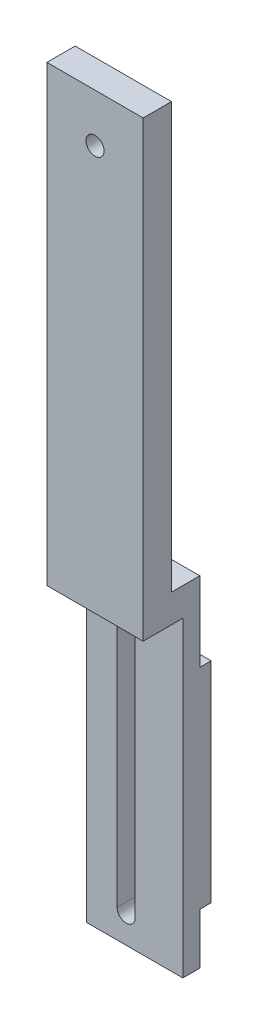
ISO-10303-21;
HEADER;
FILE_DESCRIPTION(('STEP AP214'),'2;1');
FILE_NAME('part.step','',(''),(''),'','','');
FILE_SCHEMA(('AUTOMOTIVE_DESIGN { 1 0 10303 214 1 1 1 1 }'));
ENDSEC;
DATA;
#1=APPLICATION_CONTEXT('core data for automotive mechanical design processes');
#2=APPLICATION_PROTOCOL_DEFINITION('international standard','automotive_design',2000,#1);
#3=PRODUCT_CONTEXT('',#1,'mechanical');
#4=PRODUCT('Part','Part','',(#3));
#5=PRODUCT_RELATED_PRODUCT_CATEGORY('part','',(#4));
#6=PRODUCT_DEFINITION_FORMATION('','',#4);
#7=PRODUCT_DEFINITION_CONTEXT('part definition',#1,'design');
#8=PRODUCT_DEFINITION('design','',#6,#7);
#9=PRODUCT_DEFINITION_SHAPE('','',#8);
#10=(LENGTH_UNIT() NAMED_UNIT(*) SI_UNIT(.MILLI.,.METRE.));
#11=(NAMED_UNIT(*) PLANE_ANGLE_UNIT() SI_UNIT($,.RADIAN.));
#12=(NAMED_UNIT(*) SI_UNIT($,.STERADIAN.) SOLID_ANGLE_UNIT());
#13=UNCERTAINTY_MEASURE_WITH_UNIT(LENGTH_MEASURE(1.E-05),#10,'distance_accuracy_value','');
#14=(GEOMETRIC_REPRESENTATION_CONTEXT(3) GLOBAL_UNCERTAINTY_ASSIGNED_CONTEXT((#13)) GLOBAL_UNIT_ASSIGNED_CONTEXT((#10,
#11,#12)) REPRESENTATION_CONTEXT('',''));
#15=CARTESIAN_POINT('',(0.,0.,0.));
#16=DIRECTION('',(0.,0.,1.));
#17=DIRECTION('',(1.,0.,0.));
#18=AXIS2_PLACEMENT_3D('',#15,#16,#17);
#19=CARTESIAN_POINT('',(8.5,0.,5.));
#20=DIRECTION('',(-1.,0.,0.));
#21=DIRECTION('',(0.,0.,1.));
#22=AXIS2_PLACEMENT_3D('',#19,#20,#21);
#23=PLANE('',#22);
#24=DIRECTION('',(0.,0.,-1.));
#25=VECTOR('',#24,1.);
#26=CARTESIAN_POINT('',(8.5,16.,2.));
#27=LINE('',#26,#25);
#28=CARTESIAN_POINT('',(8.5,16.,2.));
#29=VERTEX_POINT('',#28);
#30=CARTESIAN_POINT('',(8.5,16.,0.));
#31=VERTEX_POINT('',#30);
#32=EDGE_CURVE('E233',#29,#31,#27,.T.);
#33=ORIENTED_EDGE('',*,*,#32,.F.);
#34=DIRECTION('',(0.,-1.,0.));
#35=VECTOR('',#34,1.);
#36=CARTESIAN_POINT('',(8.5,0.,2.));
#37=LINE('',#36,#35);
#38=CARTESIAN_POINT('',(8.5,30.,2.));
#39=VERTEX_POINT('',#38);
#40=EDGE_CURVE('E200',#39,#29,#37,.T.);
#41=ORIENTED_EDGE('',*,*,#40,.F.);
#42=DIRECTION('',(0.,0.,-1.));
#43=VECTOR('',#42,1.);
#44=CARTESIAN_POINT('',(8.5,30.,5.));
#45=LINE('',#44,#43);
#46=CARTESIAN_POINT('',(8.5,30.,7.));
#47=VERTEX_POINT('',#46);
#48=EDGE_CURVE('E46',#47,#39,#45,.T.);
#49=ORIENTED_EDGE('',*,*,#48,.F.);
#50=DIRECTION('',(0.,-1.,0.));
#51=VECTOR('',#50,1.);
#52=CARTESIAN_POINT('',(8.5,105.,7.));
#53=LINE('',#52,#51);
#54=CARTESIAN_POINT('',(8.5,105.,7.));
#55=VERTEX_POINT('',#54);
#56=EDGE_CURVE('E299',#55,#47,#53,.T.);
#57=ORIENTED_EDGE('',*,*,#56,.F.);
#58=DIRECTION('',(0.,0.,-1.));
#59=VECTOR('',#58,1.);
#60=CARTESIAN_POINT('',(8.5,105.,12.));
#61=LINE('',#60,#59);
#62=CARTESIAN_POINT('',(8.5,105.,12.));
#63=VERTEX_POINT('',#62);
#64=EDGE_CURVE('E283',#63,#55,#61,.T.);
#65=ORIENTED_EDGE('',*,*,#64,.F.);
#66=DIRECTION('',(0.,1.,0.));
#67=VECTOR('',#66,1.);
#68=CARTESIAN_POINT('',(8.5,30.,12.));
#69=LINE('',#68,#67);
#70=CARTESIAN_POINT('',(8.5,25.,12.));
#71=VERTEX_POINT('',#70);
#72=EDGE_CURVE('E308',#71,#63,#69,.T.);
#73=ORIENTED_EDGE('',*,*,#72,.F.);
#74=DIRECTION('',(0.,0.,-1.));
#75=VECTOR('',#74,1.);
#76=CARTESIAN_POINT('',(8.5,25.,12.));
#77=LINE('',#76,#75);
#78=CARTESIAN_POINT('',(8.5,25.,5.));
#79=VERTEX_POINT('',#78);
#80=EDGE_CURVE('E310',#71,#79,#77,.T.);
#81=ORIENTED_EDGE('',*,*,#80,.T.);
#82=DIRECTION('',(0.,1.,0.));
#83=VECTOR('',#82,1.);
#84=CARTESIAN_POINT('',(8.5,0.,5.));
#85=LINE('',#84,#83);
#86=CARTESIAN_POINT('',(8.5,-30.,5.));
#87=VERTEX_POINT('',#86);
#88=EDGE_CURVE('E334',#87,#79,#85,.T.);
#89=ORIENTED_EDGE('',*,*,#88,.F.);
#90=DIRECTION('',(0.,0.,-1.));
#91=VECTOR('',#90,1.);
#92=CARTESIAN_POINT('',(8.5,-30.,5.));
#93=LINE('',#92,#91);
#94=CARTESIAN_POINT('',(8.5,-30.,2.));
#95=VERTEX_POINT('',#94);
#96=EDGE_CURVE('E11',#87,#95,#93,.T.);
#97=ORIENTED_EDGE('',*,*,#96,.T.);
#98=DIRECTION('',(0.,-1.,0.));
#99=VECTOR('',#98,1.);
#100=CARTESIAN_POINT('',(8.5,0.,2.));
#101=LINE('',#100,#99);
#102=CARTESIAN_POINT('',(8.5,-21.,2.));
#103=VERTEX_POINT('',#102);
#104=EDGE_CURVE('E258',#103,#95,#101,.T.);
#105=ORIENTED_EDGE('',*,*,#104,.F.);
#106=DIRECTION('',(0.,0.,-1.));
#107=VECTOR('',#106,1.);
#108=CARTESIAN_POINT('',(8.5,-21.,2.));
#109=LINE('',#108,#107);
#110=CARTESIAN_POINT('',(8.5,-21.,0.));
#111=VERTEX_POINT('',#110);
#112=EDGE_CURVE('E229',#103,#111,#109,.T.);
#113=ORIENTED_EDGE('',*,*,#112,.T.);
#114=DIRECTION('',(0.,1.,0.));
#115=VECTOR('',#114,1.);
#116=CARTESIAN_POINT('',(8.5,0.,0.));
#117=LINE('',#116,#115);
#118=EDGE_CURVE('E352',#111,#31,#117,.T.);
#119=ORIENTED_EDGE('',*,*,#118,.T.);
#120=EDGE_LOOP('',(#33,#41,#49,#57,#65,#73,#81,#89,#97,#105,#113,#119));
#121=FACE_BOUND('',#120,.T.);
#122=ADVANCED_FACE('F37',(#121),#23,.F.);
#123=CARTESIAN_POINT('',(0.,30.,5.));
#124=DIRECTION('',(0.,1.,0.));
#125=DIRECTION('',(0.,0.,1.));
#126=AXIS2_PLACEMENT_3D('',#123,#124,#125);
#127=PLANE('',#126);
#128=DIRECTION('',(1.,0.,0.));
#129=VECTOR('',#128,1.);
#130=CARTESIAN_POINT('',(0.,30.,2.));
#131=LINE('',#130,#129);
#132=CARTESIAN_POINT('',(0.5,30.,2.));
#133=VERTEX_POINT('',#132);
#134=EDGE_CURVE('E224',#133,#39,#131,.T.);
#135=ORIENTED_EDGE('',*,*,#134,.F.);
#136=DIRECTION('',(0.,0.,-1.));
#137=VECTOR('',#136,1.);
#138=CARTESIAN_POINT('',(0.5,30.,2.));
#139=LINE('',#138,#137);
#140=CARTESIAN_POINT('',(0.5,30.,0.));
#141=VERTEX_POINT('',#140);
#142=EDGE_CURVE('E236',#133,#141,#139,.T.);
#143=ORIENTED_EDGE('',*,*,#142,.T.);
#144=DIRECTION('',(1.,0.,0.));
#145=VECTOR('',#144,1.);
#146=CARTESIAN_POINT('',(0.,30.,0.));
#147=LINE('',#146,#145);
#148=CARTESIAN_POINT('',(-8.5,30.,0.));
#149=VERTEX_POINT('',#148);
#150=EDGE_CURVE('E355',#149,#141,#147,.T.);
#151=ORIENTED_EDGE('',*,*,#150,.F.);
#152=DIRECTION('',(0.,0.,-1.));
#153=VECTOR('',#152,1.);
#154=CARTESIAN_POINT('',(-8.5,30.,5.));
#155=LINE('',#154,#153);
#156=CARTESIAN_POINT('',(-8.5,30.,7.));
#157=VERTEX_POINT('',#156);
#158=EDGE_CURVE('E362',#157,#149,#155,.T.);
#159=ORIENTED_EDGE('',*,*,#158,.F.);
#160=DIRECTION('',(-1.,0.,0.));
#161=VECTOR('',#160,1.);
#162=CARTESIAN_POINT('',(8.5,30.,7.));
#163=LINE('',#162,#161);
#164=EDGE_CURVE('E280',#47,#157,#163,.T.);
#165=ORIENTED_EDGE('',*,*,#164,.F.);
#166=ORIENTED_EDGE('',*,*,#48,.T.);
#167=EDGE_LOOP('',(#135,#143,#151,#159,#165,#166));
#168=FACE_BOUND('',#167,.T.);
#169=ADVANCED_FACE('F391',(#168),#127,.T.);
#170=CARTESIAN_POINT('',(-1.5,-25.,5.));
#171=DIRECTION('',(0.,0.,-1.));
#172=DIRECTION('',(-1.,0.,0.));
#173=AXIS2_PLACEMENT_3D('',#170,#171,#172);
#174=CYLINDRICAL_SURFACE('',#173,1.6);
#175=CARTESIAN_POINT('',(-1.5,-25.,2.));
#176=DIRECTION('',(0.,0.,-1.));
#177=DIRECTION('',(-1.,0.,0.));
#178=AXIS2_PLACEMENT_3D('',#175,#176,#177);
#179=CIRCLE('',#178,1.6);
#180=CARTESIAN_POINT('',(-1.5,-26.6,2.));
#181=VERTEX_POINT('',#180);
#182=CARTESIAN_POINT('',(0.100000000000002,-25.,2.));
#183=VERTEX_POINT('',#182);
#184=EDGE_CURVE('E251',#181,#183,#179,.F.);
#185=ORIENTED_EDGE('',*,*,#184,.F.);
#186=DIRECTION('',(0.,0.,-1.));
#187=VECTOR('',#186,1.);
#188=CARTESIAN_POINT('',(-1.5,-26.6,2.));
#189=LINE('',#188,#187);
#190=CARTESIAN_POINT('',(-1.5,-26.6,0.));
#191=VERTEX_POINT('',#190);
#192=EDGE_CURVE('E271',#181,#191,#189,.T.);
#193=ORIENTED_EDGE('',*,*,#192,.T.);
#194=CARTESIAN_POINT('',(-1.5,-25.,0.));
#195=DIRECTION('',(0.,0.,1.));
#196=DIRECTION('',(1.,0.,0.));
#197=AXIS2_PLACEMENT_3D('',#194,#195,#196);
#198=CIRCLE('',#197,1.6);
#199=CARTESIAN_POINT('',(-3.1,-25.,0.));
#200=VERTEX_POINT('',#199);
#201=EDGE_CURVE('E318',#200,#191,#198,.T.);
#202=ORIENTED_EDGE('',*,*,#201,.F.);
#203=DIRECTION('',(0.,0.,-1.));
#204=VECTOR('',#203,1.);
#205=CARTESIAN_POINT('',(-3.1,-25.,5.));
#206=LINE('',#205,#204);
#207=CARTESIAN_POINT('',(-3.1,-25.,5.));
#208=VERTEX_POINT('',#207);
#209=EDGE_CURVE('E41',#208,#200,#206,.T.);
#210=ORIENTED_EDGE('',*,*,#209,.F.);
#211=CARTESIAN_POINT('',(-1.5,-25.,5.));
#212=DIRECTION('',(0.,0.,1.));
#213=DIRECTION('',(1.,0.,0.));
#214=AXIS2_PLACEMENT_3D('',#211,#212,#213);
#215=CIRCLE('',#214,1.6);
#216=CARTESIAN_POINT('',(0.100000000000002,-25.,5.));
#217=VERTEX_POINT('',#216);
#218=EDGE_CURVE('E319',#208,#217,#215,.T.);
#219=ORIENTED_EDGE('',*,*,#218,.T.);
#220=DIRECTION('',(0.,0.,-1.));
#221=VECTOR('',#220,1.);
#222=CARTESIAN_POINT('',(0.100000000000002,-25.,5.));
#223=LINE('',#222,#221);
#224=EDGE_CURVE('E339',#217,#183,#223,.T.);
#225=ORIENTED_EDGE('',*,*,#224,.T.);
#226=EDGE_LOOP('',(#185,#193,#202,#210,#219,#225));
#227=FACE_BOUND('',#226,.T.);
#228=ADVANCED_FACE('F39',(#227),#174,.F.);
#229=CARTESIAN_POINT('',(0.0999999999999946,0.,5.));
#230=DIRECTION('',(1.,0.,0.));
#231=DIRECTION('',(0.,1.,0.));
#232=AXIS2_PLACEMENT_3D('',#229,#230,#231);
#233=PLANE('',#232);
#234=DIRECTION('',(0.,0.,-1.));
#235=VECTOR('',#234,1.);
#236=CARTESIAN_POINT('',(0.0999999999999898,16.,2.));
#237=LINE('',#236,#235);
#238=CARTESIAN_POINT('',(0.0999999999999898,16.,2.));
#239=VERTEX_POINT('',#238);
#240=CARTESIAN_POINT('',(0.0999999999999898,16.,0.));
#241=VERTEX_POINT('',#240);
#242=EDGE_CURVE('E189',#239,#241,#237,.T.);
#243=ORIENTED_EDGE('',*,*,#242,.T.);
#244=DIRECTION('',(0.,-1.,0.));
#245=VECTOR('',#244,1.);
#246=CARTESIAN_POINT('',(0.0999999999999946,0.,0.));
#247=LINE('',#246,#245);
#248=CARTESIAN_POINT('',(0.100000000000001,-21.,0.));
#249=VERTEX_POINT('',#248);
#250=EDGE_CURVE('E347',#241,#249,#247,.T.);
#251=ORIENTED_EDGE('',*,*,#250,.T.);
#252=DIRECTION('',(0.,0.,-1.));
#253=VECTOR('',#252,1.);
#254=CARTESIAN_POINT('',(0.100000000000001,-21.,2.));
#255=LINE('',#254,#253);
#256=CARTESIAN_POINT('',(0.100000000000001,-21.,2.));
#257=VERTEX_POINT('',#256);
#258=EDGE_CURVE('E269',#257,#249,#255,.T.);
#259=ORIENTED_EDGE('',*,*,#258,.F.);
#260=DIRECTION('',(0.,1.,0.));
#261=VECTOR('',#260,1.);
#262=CARTESIAN_POINT('',(0.0999999999999946,0.,2.));
#263=LINE('',#262,#261);
#264=EDGE_CURVE('E253',#183,#257,#263,.T.);
#265=ORIENTED_EDGE('',*,*,#264,.F.);
#266=ORIENTED_EDGE('',*,*,#224,.F.);
#267=DIRECTION('',(0.,-1.,0.));
#268=VECTOR('',#267,1.);
#269=CARTESIAN_POINT('',(0.0999999999999946,0.,5.));
#270=LINE('',#269,#268);
#271=CARTESIAN_POINT('',(0.0999999999999887,20.,5.));
#272=VERTEX_POINT('',#271);
#273=EDGE_CURVE('E329',#272,#217,#270,.T.);
#274=ORIENTED_EDGE('',*,*,#273,.F.);
#275=DIRECTION('',(0.,0.,-1.));
#276=VECTOR('',#275,1.);
#277=CARTESIAN_POINT('',(0.0999999999999887,20.,5.));
#278=LINE('',#277,#276);
#279=CARTESIAN_POINT('',(0.0999999999999883,20.,2.));
#280=VERTEX_POINT('',#279);
#281=EDGE_CURVE('E214',#272,#280,#278,.T.);
#282=ORIENTED_EDGE('',*,*,#281,.T.);
#283=DIRECTION('',(0.,1.,0.));
#284=VECTOR('',#283,1.);
#285=CARTESIAN_POINT('',(0.0999999999999946,0.,2.));
#286=LINE('',#285,#284);
#287=EDGE_CURVE('E205',#239,#280,#286,.T.);
#288=ORIENTED_EDGE('',*,*,#287,.F.);
#289=EDGE_LOOP('',(#243,#251,#259,#265,#266,#274,#282,#288));
#290=FACE_BOUND('',#289,.T.);
#291=ADVANCED_FACE('F212',(#290),#233,.F.);
#292=CARTESIAN_POINT('',(0.,0.,0.));
#293=DIRECTION('',(0.,0.,1.));
#294=DIRECTION('',(1.,0.,0.));
#295=AXIS2_PLACEMENT_3D('',#292,#293,#294);
#296=PLANE('',#295);
#297=DIRECTION('',(1.,0.,0.));
#298=VECTOR('',#297,1.);
#299=CARTESIAN_POINT('',(0.,16.,0.));
#300=LINE('',#299,#298);
#301=EDGE_CURVE('E195',#241,#31,#300,.T.);
#302=ORIENTED_EDGE('',*,*,#301,.T.);
#303=ORIENTED_EDGE('',*,*,#118,.F.);
#304=DIRECTION('',(-1.,0.,0.));
#305=VECTOR('',#304,1.);
#306=CARTESIAN_POINT('',(0.,-21.,0.));
#307=LINE('',#306,#305);
#308=EDGE_CURVE('E246',#111,#249,#307,.T.);
#309=ORIENTED_EDGE('',*,*,#308,.T.);
#310=ORIENTED_EDGE('',*,*,#250,.F.);
#311=EDGE_LOOP('',(#302,#303,#309,#310));
#312=FACE_BOUND('',#311,.T.);
#313=ADVANCED_FACE('F408',(#312),#296,.F.);
#314=DIRECTION('',(0.,-1.,0.));
#315=VECTOR('',#314,1.);
#316=CARTESIAN_POINT('',(0.499999999999997,0.,0.));
#317=LINE('',#316,#315);
#318=CARTESIAN_POINT('',(0.499999999999999,21.6,0.));
#319=VERTEX_POINT('',#318);
#320=EDGE_CURVE('E209',#141,#319,#317,.T.);
#321=ORIENTED_EDGE('',*,*,#320,.T.);
#322=DIRECTION('',(1.,0.,0.));
#323=VECTOR('',#322,1.);
#324=CARTESIAN_POINT('',(0.,21.6,0.));
#325=LINE('',#324,#323);
#326=CARTESIAN_POINT('',(-1.50000000000001,21.6,0.));
#327=VERTEX_POINT('',#326);
#328=EDGE_CURVE('E228',#327,#319,#325,.T.);
#329=ORIENTED_EDGE('',*,*,#328,.F.);
#330=CARTESIAN_POINT('',(-1.50000000000001,20.,0.));
#331=DIRECTION('',(0.,0.,1.));
#332=DIRECTION('',(1.,0.,0.));
#333=AXIS2_PLACEMENT_3D('',#330,#331,#332);
#334=CIRCLE('',#333,1.6);
#335=CARTESIAN_POINT('',(-3.10000000000001,20.,0.));
#336=VERTEX_POINT('',#335);
#337=EDGE_CURVE('E345',#327,#336,#334,.T.);
#338=ORIENTED_EDGE('',*,*,#337,.T.);
#339=DIRECTION('',(0.,-1.,0.));
#340=VECTOR('',#339,1.);
#341=CARTESIAN_POINT('',(-3.10000000000001,0.,0.));
#342=LINE('',#341,#340);
#343=EDGE_CURVE('E342',#336,#200,#342,.T.);
#344=ORIENTED_EDGE('',*,*,#343,.T.);
#345=ORIENTED_EDGE('',*,*,#201,.T.);
#346=DIRECTION('',(1.,0.,0.));
#347=VECTOR('',#346,1.);
#348=CARTESIAN_POINT('',(0.,-26.6,0.));
#349=LINE('',#348,#347);
#350=CARTESIAN_POINT('',(0.499999999999997,-26.6,0.));
#351=VERTEX_POINT('',#350);
#352=EDGE_CURVE('E262',#191,#351,#349,.T.);
#353=ORIENTED_EDGE('',*,*,#352,.T.);
#354=DIRECTION('',(0.,1.,0.));
#355=VECTOR('',#354,1.);
#356=CARTESIAN_POINT('',(0.499999999999981,0.,0.));
#357=LINE('',#356,#355);
#358=CARTESIAN_POINT('',(0.499999999999998,-30.,0.));
#359=VERTEX_POINT('',#358);
#360=EDGE_CURVE('E260',#359,#351,#357,.T.);
#361=ORIENTED_EDGE('',*,*,#360,.F.);
#362=DIRECTION('',(1.,0.,0.));
#363=VECTOR('',#362,1.);
#364=CARTESIAN_POINT('',(0.,-30.,0.));
#365=LINE('',#364,#363);
#366=CARTESIAN_POINT('',(-8.5,-30.,0.));
#367=VERTEX_POINT('',#366);
#368=EDGE_CURVE('E349',#367,#359,#365,.T.);
#369=ORIENTED_EDGE('',*,*,#368,.F.);
#370=DIRECTION('',(0.,1.,0.));
#371=VECTOR('',#370,1.);
#372=CARTESIAN_POINT('',(-8.5,0.,0.));
#373=LINE('',#372,#371);
#374=EDGE_CURVE('E323',#367,#149,#373,.T.);
#375=ORIENTED_EDGE('',*,*,#374,.T.);
#376=ORIENTED_EDGE('',*,*,#150,.T.);
#377=EDGE_LOOP('',(#321,#329,#338,#344,#345,#353,#361,#369,#375,#376));
#378=FACE_BOUND('',#377,.T.);
#379=ADVANCED_FACE('F381',(#378),#296,.F.);
#380=CARTESIAN_POINT('',(0.,-30.,5.));
#381=DIRECTION('',(0.,1.,0.));
#382=DIRECTION('',(0.,0.,1.));
#383=AXIS2_PLACEMENT_3D('',#380,#381,#382);
#384=PLANE('',#383);
#385=ORIENTED_EDGE('',*,*,#368,.T.);
#386=DIRECTION('',(0.,0.,-1.));
#387=VECTOR('',#386,1.);
#388=CARTESIAN_POINT('',(0.499999999999999,-30.,2.));
#389=LINE('',#388,#387);
#390=CARTESIAN_POINT('',(0.499999999999999,-30.,2.));
#391=VERTEX_POINT('',#390);
#392=EDGE_CURVE('E54',#391,#359,#389,.T.);
#393=ORIENTED_EDGE('',*,*,#392,.F.);
#394=DIRECTION('',(-1.,0.,0.));
#395=VECTOR('',#394,1.);
#396=CARTESIAN_POINT('',(0.,-30.,2.));
#397=LINE('',#396,#395);
#398=EDGE_CURVE('E242',#95,#391,#397,.T.);
#399=ORIENTED_EDGE('',*,*,#398,.F.);
#400=ORIENTED_EDGE('',*,*,#96,.F.);
#401=DIRECTION('',(1.,0.,0.));
#402=VECTOR('',#401,1.);
#403=CARTESIAN_POINT('',(0.,-30.,5.));
#404=LINE('',#403,#402);
#405=CARTESIAN_POINT('',(-8.5,-30.,5.));
#406=VERTEX_POINT('',#405);
#407=EDGE_CURVE('E331',#406,#87,#404,.T.);
#408=ORIENTED_EDGE('',*,*,#407,.F.);
#409=DIRECTION('',(0.,0.,-1.));
#410=VECTOR('',#409,1.);
#411=CARTESIAN_POINT('',(-8.5,-30.,5.));
#412=LINE('',#411,#410);
#413=EDGE_CURVE('E360',#406,#367,#412,.T.);
#414=ORIENTED_EDGE('',*,*,#413,.T.);
#415=EDGE_LOOP('',(#385,#393,#399,#400,#408,#414));
#416=FACE_BOUND('',#415,.T.);
#417=ADVANCED_FACE('F442',(#416),#384,.F.);
#418=CARTESIAN_POINT('',(-3.10000000000001,0.,5.));
#419=DIRECTION('',(1.,0.,0.));
#420=DIRECTION('',(0.,1.,0.));
#421=AXIS2_PLACEMENT_3D('',#418,#419,#420);
#422=PLANE('',#421);
#423=ORIENTED_EDGE('',*,*,#343,.F.);
#424=DIRECTION('',(0.,0.,-1.));
#425=VECTOR('',#424,1.);
#426=CARTESIAN_POINT('',(-3.10000000000001,20.,5.));
#427=LINE('',#426,#425);
#428=CARTESIAN_POINT('',(-3.10000000000001,20.,5.));
#429=VERTEX_POINT('',#428);
#430=EDGE_CURVE('E368',#429,#336,#427,.T.);
#431=ORIENTED_EDGE('',*,*,#430,.F.);
#432=DIRECTION('',(0.,-1.,0.));
#433=VECTOR('',#432,1.);
#434=CARTESIAN_POINT('',(-3.10000000000001,0.,5.));
#435=LINE('',#434,#433);
#436=EDGE_CURVE('E322',#429,#208,#435,.T.);
#437=ORIENTED_EDGE('',*,*,#436,.T.);
#438=ORIENTED_EDGE('',*,*,#209,.T.);
#439=EDGE_LOOP('',(#423,#431,#437,#438));
#440=FACE_BOUND('',#439,.T.);
#441=ADVANCED_FACE('F375',(#440),#422,.T.);
#442=CARTESIAN_POINT('',(-1.50000000000001,20.,5.));
#443=DIRECTION('',(0.,0.,-1.));
#444=DIRECTION('',(-1.,0.,0.));
#445=AXIS2_PLACEMENT_3D('',#442,#443,#444);
#446=CYLINDRICAL_SURFACE('',#445,1.6);
#447=DIRECTION('',(0.,0.,-1.));
#448=VECTOR('',#447,1.);
#449=CARTESIAN_POINT('',(-1.50000000000001,21.6,2.));
#450=LINE('',#449,#448);
#451=CARTESIAN_POINT('',(-1.50000000000001,21.6,2.));
#452=VERTEX_POINT('',#451);
#453=EDGE_CURVE('E62',#452,#327,#450,.T.);
#454=ORIENTED_EDGE('',*,*,#453,.F.);
#455=CARTESIAN_POINT('',(-1.50000000000001,20.,2.));
#456=DIRECTION('',(0.,0.,-1.));
#457=DIRECTION('',(-1.,0.,0.));
#458=AXIS2_PLACEMENT_3D('',#455,#456,#457);
#459=CIRCLE('',#458,1.6);
#460=EDGE_CURVE('E215',#280,#452,#459,.F.);
#461=ORIENTED_EDGE('',*,*,#460,.F.);
#462=ORIENTED_EDGE('',*,*,#281,.F.);
#463=CARTESIAN_POINT('',(-1.50000000000001,20.,5.));
#464=DIRECTION('',(0.,0.,1.));
#465=DIRECTION('',(1.,0.,0.));
#466=AXIS2_PLACEMENT_3D('',#463,#464,#465);
#467=CIRCLE('',#466,1.6);
#468=EDGE_CURVE('E326',#272,#429,#467,.T.);
#469=ORIENTED_EDGE('',*,*,#468,.T.);
#470=ORIENTED_EDGE('',*,*,#430,.T.);
#471=ORIENTED_EDGE('',*,*,#337,.F.);
#472=EDGE_LOOP('',(#454,#461,#462,#469,#470,#471));
#473=FACE_BOUND('',#472,.T.);
#474=ADVANCED_FACE('F382',(#473),#446,.F.);
#475=CARTESIAN_POINT('',(-8.5,0.,5.));
#476=DIRECTION('',(-1.,0.,0.));
#477=DIRECTION('',(0.,0.,1.));
#478=AXIS2_PLACEMENT_3D('',#475,#476,#477);
#479=PLANE('',#478);
#480=ORIENTED_EDGE('',*,*,#374,.F.);
#481=ORIENTED_EDGE('',*,*,#413,.F.);
#482=DIRECTION('',(0.,1.,0.));
#483=VECTOR('',#482,1.);
#484=CARTESIAN_POINT('',(-8.5,0.,5.));
#485=LINE('',#484,#483);
#486=CARTESIAN_POINT('',(-8.5,25.,5.));
#487=VERTEX_POINT('',#486);
#488=EDGE_CURVE('E336',#406,#487,#485,.T.);
#489=ORIENTED_EDGE('',*,*,#488,.T.);
#490=DIRECTION('',(0.,0.,-1.));
#491=VECTOR('',#490,1.);
#492=CARTESIAN_POINT('',(-8.5,25.,12.));
#493=LINE('',#492,#491);
#494=CARTESIAN_POINT('',(-8.5,25.,12.));
#495=VERTEX_POINT('',#494);
#496=EDGE_CURVE('E315',#495,#487,#493,.T.);
#497=ORIENTED_EDGE('',*,*,#496,.F.);
#498=DIRECTION('',(0.,-1.,0.));
#499=VECTOR('',#498,1.);
#500=CARTESIAN_POINT('',(-8.5,30.,12.));
#501=LINE('',#500,#499);
#502=CARTESIAN_POINT('',(-8.5,105.,12.));
#503=VERTEX_POINT('',#502);
#504=EDGE_CURVE('E303',#503,#495,#501,.T.);
#505=ORIENTED_EDGE('',*,*,#504,.F.);
#506=DIRECTION('',(0.,0.,1.));
#507=VECTOR('',#506,1.);
#508=CARTESIAN_POINT('',(-8.5,105.,12.));
#509=LINE('',#508,#507);
#510=CARTESIAN_POINT('',(-8.5,105.,7.));
#511=VERTEX_POINT('',#510);
#512=EDGE_CURVE('E288',#511,#503,#509,.T.);
#513=ORIENTED_EDGE('',*,*,#512,.F.);
#514=DIRECTION('',(0.,-1.,0.));
#515=VECTOR('',#514,1.);
#516=CARTESIAN_POINT('',(-8.5,105.,7.));
#517=LINE('',#516,#515);
#518=EDGE_CURVE('E294',#511,#157,#517,.T.);
#519=ORIENTED_EDGE('',*,*,#518,.T.);
#520=ORIENTED_EDGE('',*,*,#158,.T.);
#521=EDGE_LOOP('',(#480,#481,#489,#497,#505,#513,#519,#520));
#522=FACE_BOUND('',#521,.T.);
#523=ADVANCED_FACE('F395',(#522),#479,.T.);
#524=CARTESIAN_POINT('',(0.,0.,5.));
#525=DIRECTION('',(0.,0.,1.));
#526=DIRECTION('',(1.,0.,0.));
#527=AXIS2_PLACEMENT_3D('',#524,#525,#526);
#528=PLANE('',#527);
#529=DIRECTION('',(1.,0.,0.));
#530=VECTOR('',#529,1.);
#531=CARTESIAN_POINT('',(-8.5,25.,5.));
#532=LINE('',#531,#530);
#533=EDGE_CURVE('E302',#487,#79,#532,.T.);
#534=ORIENTED_EDGE('',*,*,#533,.F.);
#535=ORIENTED_EDGE('',*,*,#488,.F.);
#536=ORIENTED_EDGE('',*,*,#407,.T.);
#537=ORIENTED_EDGE('',*,*,#88,.T.);
#538=EDGE_LOOP('',(#534,#535,#536,#537));
#539=FACE_BOUND('',#538,.T.);
#540=ORIENTED_EDGE('',*,*,#218,.F.);
#541=ORIENTED_EDGE('',*,*,#436,.F.);
#542=ORIENTED_EDGE('',*,*,#468,.F.);
#543=ORIENTED_EDGE('',*,*,#273,.T.);
#544=EDGE_LOOP('',(#540,#541,#542,#543));
#545=FACE_BOUND('',#544,.T.);
#546=ADVANCED_FACE('F421',(#539,#545),#528,.T.);
#547=CARTESIAN_POINT('',(-8.5,25.,12.));
#548=DIRECTION('',(0.,1.,0.));
#549=DIRECTION('',(-1.,0.,0.));
#550=AXIS2_PLACEMENT_3D('',#547,#548,#549);
#551=PLANE('',#550);
#552=ORIENTED_EDGE('',*,*,#533,.T.);
#553=ORIENTED_EDGE('',*,*,#80,.F.);
#554=DIRECTION('',(1.,0.,0.));
#555=VECTOR('',#554,1.);
#556=CARTESIAN_POINT('',(-8.5,25.,12.));
#557=LINE('',#556,#555);
#558=EDGE_CURVE('E306',#495,#71,#557,.T.);
#559=ORIENTED_EDGE('',*,*,#558,.F.);
#560=ORIENTED_EDGE('',*,*,#496,.T.);
#561=EDGE_LOOP('',(#552,#553,#559,#560));
#562=FACE_BOUND('',#561,.T.);
#563=ADVANCED_FACE('F423',(#562),#551,.F.);
#564=CARTESIAN_POINT('',(0.,0.,12.));
#565=DIRECTION('',(0.,0.,1.));
#566=DIRECTION('',(1.,0.,0.));
#567=AXIS2_PLACEMENT_3D('',#564,#565,#566);
#568=PLANE('',#567);
#569=CARTESIAN_POINT('',(0.,96.5,12.));
#570=DIRECTION('',(0.,0.,-1.));
#571=DIRECTION('',(-1.,0.,0.));
#572=AXIS2_PLACEMENT_3D('',#569,#570,#571);
#573=CIRCLE('',#572,1.6);
#574=CARTESIAN_POINT('',(-1.6,96.5,12.));
#575=VERTEX_POINT('',#574);
#576=EDGE_CURVE('E277',#575,#575,#573,.T.);
#577=ORIENTED_EDGE('',*,*,#576,.T.);
#578=EDGE_LOOP('',(#577));
#579=FACE_BOUND('',#578,.T.);
#580=ORIENTED_EDGE('',*,*,#504,.T.);
#581=ORIENTED_EDGE('',*,*,#558,.T.);
#582=ORIENTED_EDGE('',*,*,#72,.T.);
#583=DIRECTION('',(1.,0.,0.));
#584=VECTOR('',#583,1.);
#585=CARTESIAN_POINT('',(8.5,105.,12.));
#586=LINE('',#585,#584);
#587=EDGE_CURVE('E291',#503,#63,#586,.T.);
#588=ORIENTED_EDGE('',*,*,#587,.F.);
#589=EDGE_LOOP('',(#580,#581,#582,#588));
#590=FACE_BOUND('',#589,.T.);
#591=ADVANCED_FACE('F430',(#579,#590),#568,.T.);
#592=CARTESIAN_POINT('',(8.5,105.,7.));
#593=DIRECTION('',(0.,0.,1.));
#594=DIRECTION('',(1.,0.,0.));
#595=AXIS2_PLACEMENT_3D('',#592,#593,#594);
#596=PLANE('',#595);
#597=CARTESIAN_POINT('',(0.,96.5,7.));
#598=DIRECTION('',(0.,0.,-1.));
#599=DIRECTION('',(-1.,0.,0.));
#600=AXIS2_PLACEMENT_3D('',#597,#598,#599);
#601=CIRCLE('',#600,1.6);
#602=CARTESIAN_POINT('',(-1.6,96.5,7.));
#603=VERTEX_POINT('',#602);
#604=EDGE_CURVE('E235',#603,#603,#601,.T.);
#605=ORIENTED_EDGE('',*,*,#604,.F.);
#606=EDGE_LOOP('',(#605));
#607=FACE_BOUND('',#606,.T.);
#608=ORIENTED_EDGE('',*,*,#164,.T.);
#609=ORIENTED_EDGE('',*,*,#518,.F.);
#610=DIRECTION('',(-1.,0.,0.));
#611=VECTOR('',#610,1.);
#612=CARTESIAN_POINT('',(8.5,105.,7.));
#613=LINE('',#612,#611);
#614=EDGE_CURVE('E286',#55,#511,#613,.T.);
#615=ORIENTED_EDGE('',*,*,#614,.F.);
#616=ORIENTED_EDGE('',*,*,#56,.T.);
#617=EDGE_LOOP('',(#608,#609,#615,#616));
#618=FACE_BOUND('',#617,.T.);
#619=ADVANCED_FACE('F401',(#607,#618),#596,.F.);
#620=CARTESIAN_POINT('',(0.,105.,0.));
#621=DIRECTION('',(0.,1.,0.));
#622=DIRECTION('',(0.,0.,1.));
#623=AXIS2_PLACEMENT_3D('',#620,#621,#622);
#624=PLANE('',#623);
#625=ORIENTED_EDGE('',*,*,#64,.T.);
#626=ORIENTED_EDGE('',*,*,#614,.T.);
#627=ORIENTED_EDGE('',*,*,#512,.T.);
#628=ORIENTED_EDGE('',*,*,#587,.T.);
#629=EDGE_LOOP('',(#625,#626,#627,#628));
#630=FACE_BOUND('',#629,.T.);
#631=ADVANCED_FACE('F475',(#630),#624,.T.);
#632=CARTESIAN_POINT('',(0.,96.5,12.));
#633=DIRECTION('',(0.,0.,-1.));
#634=DIRECTION('',(-1.,0.,0.));
#635=AXIS2_PLACEMENT_3D('',#632,#633,#634);
#636=CYLINDRICAL_SURFACE('',#635,1.6);
#637=ORIENTED_EDGE('',*,*,#576,.F.);
#638=EDGE_LOOP('',(#637));
#639=FACE_BOUND('',#638,.T.);
#640=ORIENTED_EDGE('',*,*,#604,.T.);
#641=EDGE_LOOP('',(#640));
#642=FACE_BOUND('',#641,.T.);
#643=ADVANCED_FACE('F480',(#639,#642),#636,.F.);
#644=CARTESIAN_POINT('',(0.,-21.,2.));
#645=DIRECTION('',(0.,-1.,0.));
#646=DIRECTION('',(0.,0.,-1.));
#647=AXIS2_PLACEMENT_3D('',#644,#645,#646);
#648=PLANE('',#647);
#649=ORIENTED_EDGE('',*,*,#308,.F.);
#650=ORIENTED_EDGE('',*,*,#112,.F.);
#651=DIRECTION('',(-1.,0.,0.));
#652=VECTOR('',#651,1.);
#653=CARTESIAN_POINT('',(0.,-21.,2.));
#654=LINE('',#653,#652);
#655=EDGE_CURVE('E256',#103,#257,#654,.T.);
#656=ORIENTED_EDGE('',*,*,#655,.T.);
#657=ORIENTED_EDGE('',*,*,#258,.T.);
#658=EDGE_LOOP('',(#649,#650,#656,#657));
#659=FACE_BOUND('',#658,.T.);
#660=ADVANCED_FACE('F413',(#659),#648,.T.);
#661=CARTESIAN_POINT('',(0.,-26.6,2.));
#662=DIRECTION('',(0.,1.,0.));
#663=DIRECTION('',(0.,0.,1.));
#664=AXIS2_PLACEMENT_3D('',#661,#662,#663);
#665=PLANE('',#664);
#666=ORIENTED_EDGE('',*,*,#352,.F.);
#667=ORIENTED_EDGE('',*,*,#192,.F.);
#668=DIRECTION('',(1.,0.,0.));
#669=VECTOR('',#668,1.);
#670=CARTESIAN_POINT('',(0.,-26.6,2.));
#671=LINE('',#670,#669);
#672=CARTESIAN_POINT('',(0.499999999999997,-26.6,2.));
#673=VERTEX_POINT('',#672);
#674=EDGE_CURVE('E249',#181,#673,#671,.T.);
#675=ORIENTED_EDGE('',*,*,#674,.T.);
#676=DIRECTION('',(0.,0.,-1.));
#677=VECTOR('',#676,1.);
#678=CARTESIAN_POINT('',(0.499999999999997,-26.6,2.));
#679=LINE('',#678,#677);
#680=EDGE_CURVE('E274',#673,#351,#679,.T.);
#681=ORIENTED_EDGE('',*,*,#680,.T.);
#682=EDGE_LOOP('',(#666,#667,#675,#681));
#683=FACE_BOUND('',#682,.T.);
#684=ADVANCED_FACE('F585',(#683),#665,.T.);
#685=CARTESIAN_POINT('',(0.499999999999981,0.,2.));
#686=DIRECTION('',(-1.,0.,0.));
#687=DIRECTION('',(0.,-1.,0.));
#688=AXIS2_PLACEMENT_3D('',#685,#686,#687);
#689=PLANE('',#688);
#690=ORIENTED_EDGE('',*,*,#360,.T.);
#691=ORIENTED_EDGE('',*,*,#680,.F.);
#692=DIRECTION('',(0.,1.,0.));
#693=VECTOR('',#692,1.);
#694=CARTESIAN_POINT('',(0.499999999999981,0.,2.));
#695=LINE('',#694,#693);
#696=EDGE_CURVE('E245',#391,#673,#695,.T.);
#697=ORIENTED_EDGE('',*,*,#696,.F.);
#698=ORIENTED_EDGE('',*,*,#392,.T.);
#699=EDGE_LOOP('',(#690,#691,#697,#698));
#700=FACE_BOUND('',#699,.T.);
#701=ADVANCED_FACE('F596',(#700),#689,.F.);
#702=CARTESIAN_POINT('',(0.,0.,2.));
#703=DIRECTION('',(0.,0.,-1.));
#704=DIRECTION('',(-1.,0.,0.));
#705=AXIS2_PLACEMENT_3D('',#702,#703,#704);
#706=PLANE('',#705);
#707=ORIENTED_EDGE('',*,*,#398,.T.);
#708=ORIENTED_EDGE('',*,*,#696,.T.);
#709=ORIENTED_EDGE('',*,*,#674,.F.);
#710=ORIENTED_EDGE('',*,*,#184,.T.);
#711=ORIENTED_EDGE('',*,*,#264,.T.);
#712=ORIENTED_EDGE('',*,*,#655,.F.);
#713=ORIENTED_EDGE('',*,*,#104,.T.);
#714=EDGE_LOOP('',(#707,#708,#709,#710,#711,#712,#713));
#715=FACE_BOUND('',#714,.T.);
#716=ADVANCED_FACE('F417',(#715),#706,.T.);
#717=CARTESIAN_POINT('',(0.,16.,2.));
#718=DIRECTION('',(0.,1.,0.));
#719=DIRECTION('',(0.,0.,1.));
#720=AXIS2_PLACEMENT_3D('',#717,#718,#719);
#721=PLANE('',#720);
#722=ORIENTED_EDGE('',*,*,#301,.F.);
#723=ORIENTED_EDGE('',*,*,#242,.F.);
#724=DIRECTION('',(1.,0.,0.));
#725=VECTOR('',#724,1.);
#726=CARTESIAN_POINT('',(0.,16.,2.));
#727=LINE('',#726,#725);
#728=EDGE_CURVE('E192',#239,#29,#727,.T.);
#729=ORIENTED_EDGE('',*,*,#728,.T.);
#730=ORIENTED_EDGE('',*,*,#32,.T.);
#731=EDGE_LOOP('',(#722,#723,#729,#730));
#732=FACE_BOUND('',#731,.T.);
#733=ADVANCED_FACE('F191',(#732),#721,.T.);
#734=CARTESIAN_POINT('',(0.499999999999997,0.,2.));
#735=DIRECTION('',(1.,0.,0.));
#736=DIRECTION('',(0.,1.,0.));
#737=AXIS2_PLACEMENT_3D('',#734,#735,#736);
#738=PLANE('',#737);
#739=ORIENTED_EDGE('',*,*,#320,.F.);
#740=ORIENTED_EDGE('',*,*,#142,.F.);
#741=DIRECTION('',(0.,-1.,0.));
#742=VECTOR('',#741,1.);
#743=CARTESIAN_POINT('',(0.499999999999997,0.,2.));
#744=LINE('',#743,#742);
#745=CARTESIAN_POINT('',(0.499999999999999,21.6,2.));
#746=VERTEX_POINT('',#745);
#747=EDGE_CURVE('E222',#133,#746,#744,.T.);
#748=ORIENTED_EDGE('',*,*,#747,.T.);
#749=DIRECTION('',(0.,0.,-1.));
#750=VECTOR('',#749,1.);
#751=CARTESIAN_POINT('',(0.499999999999999,21.6,2.));
#752=LINE('',#751,#750);
#753=EDGE_CURVE('E239',#746,#319,#752,.T.);
#754=ORIENTED_EDGE('',*,*,#753,.T.);
#755=EDGE_LOOP('',(#739,#740,#748,#754));
#756=FACE_BOUND('',#755,.T.);
#757=ADVANCED_FACE('F388',(#756),#738,.T.);
#758=CARTESIAN_POINT('',(0.,21.6,2.));
#759=DIRECTION('',(0.,1.,0.));
#760=DIRECTION('',(0.,0.,1.));
#761=AXIS2_PLACEMENT_3D('',#758,#759,#760);
#762=PLANE('',#761);
#763=ORIENTED_EDGE('',*,*,#328,.T.);
#764=ORIENTED_EDGE('',*,*,#753,.F.);
#765=DIRECTION('',(1.,0.,0.));
#766=VECTOR('',#765,1.);
#767=CARTESIAN_POINT('',(0.,21.6,2.));
#768=LINE('',#767,#766);
#769=EDGE_CURVE('E217',#452,#746,#768,.T.);
#770=ORIENTED_EDGE('',*,*,#769,.F.);
#771=ORIENTED_EDGE('',*,*,#453,.T.);
#772=EDGE_LOOP('',(#763,#764,#770,#771));
#773=FACE_BOUND('',#772,.T.);
#774=ADVANCED_FACE('F386',(#773),#762,.F.);
#775=CARTESIAN_POINT('',(0.,0.,2.));
#776=DIRECTION('',(0.,0.,-1.));
#777=DIRECTION('',(-1.,0.,0.));
#778=AXIS2_PLACEMENT_3D('',#775,#776,#777);
#779=PLANE('',#778);
#780=ORIENTED_EDGE('',*,*,#728,.F.);
#781=ORIENTED_EDGE('',*,*,#287,.T.);
#782=ORIENTED_EDGE('',*,*,#460,.T.);
#783=ORIENTED_EDGE('',*,*,#769,.T.);
#784=ORIENTED_EDGE('',*,*,#747,.F.);
#785=ORIENTED_EDGE('',*,*,#134,.T.);
#786=ORIENTED_EDGE('',*,*,#40,.T.);
#787=EDGE_LOOP('',(#780,#781,#782,#783,#784,#785,#786));
#788=FACE_BOUND('',#787,.T.);
#789=ADVANCED_FACE('F203',(#788),#779,.T.);
#790=CLOSED_SHELL('',(#122,#169,#228,#291,#313,#379,#417,#441,#474,#523,#546,#563,#591,#619,
#631,#643,#660,#684,#701,#716,#733,#757,#774,#789));
#791=MANIFOLD_SOLID_BREP('B2',#790);
#792=ADVANCED_BREP_SHAPE_REPRESENTATION('',(#18,#791),#14);
#793=SHAPE_DEFINITION_REPRESENTATION(#9,#792);
ENDSEC;
END-ISO-10303-21;
